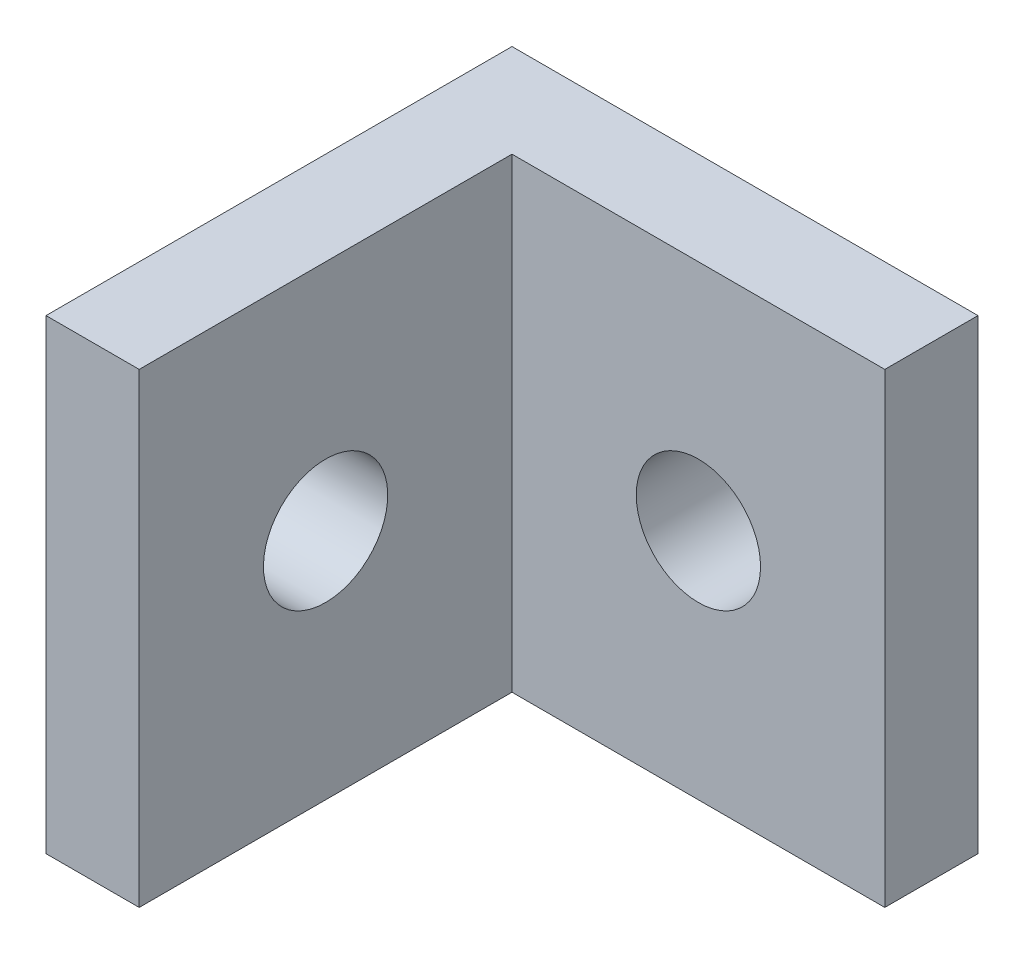
ISO-10303-21;
HEADER;
FILE_DESCRIPTION(('STEP AP214'),'2;1');
FILE_NAME('part.step','',(''),(''),'','','');
FILE_SCHEMA(('AUTOMOTIVE_DESIGN { 1 0 10303 214 1 1 1 1 }'));
ENDSEC;
DATA;
#1=APPLICATION_CONTEXT('core data for automotive mechanical design processes');
#2=APPLICATION_PROTOCOL_DEFINITION('international standard','automotive_design',2000,#1);
#3=PRODUCT_CONTEXT('',#1,'mechanical');
#4=PRODUCT('Part','Part','',(#3));
#5=PRODUCT_RELATED_PRODUCT_CATEGORY('part','',(#4));
#6=PRODUCT_DEFINITION_FORMATION('','',#4);
#7=PRODUCT_DEFINITION_CONTEXT('part definition',#1,'design');
#8=PRODUCT_DEFINITION('design','',#6,#7);
#9=PRODUCT_DEFINITION_SHAPE('','',#8);
#10=(LENGTH_UNIT() NAMED_UNIT(*) SI_UNIT(.MILLI.,.METRE.));
#11=(NAMED_UNIT(*) PLANE_ANGLE_UNIT() SI_UNIT($,.RADIAN.));
#12=(NAMED_UNIT(*) SI_UNIT($,.STERADIAN.) SOLID_ANGLE_UNIT());
#13=UNCERTAINTY_MEASURE_WITH_UNIT(LENGTH_MEASURE(1.E-05),#10,'distance_accuracy_value','');
#14=(GEOMETRIC_REPRESENTATION_CONTEXT(3) GLOBAL_UNCERTAINTY_ASSIGNED_CONTEXT((#13)) GLOBAL_UNIT_ASSIGNED_CONTEXT((#10,
#11,#12)) REPRESENTATION_CONTEXT('',''));
#15=CARTESIAN_POINT('',(0.,0.,0.));
#16=DIRECTION('',(0.,0.,1.));
#17=DIRECTION('',(1.,0.,0.));
#18=AXIS2_PLACEMENT_3D('',#15,#16,#17);
#19=CARTESIAN_POINT('',(7.5,7.5,3.));
#20=DIRECTION('',(-1.,0.,0.));
#21=DIRECTION('',(0.,0.,1.));
#22=AXIS2_PLACEMENT_3D('',#19,#20,#21);
#23=PLANE('',#22);
#24=DIRECTION('',(0.,1.,0.));
#25=VECTOR('',#24,1.);
#26=CARTESIAN_POINT('',(7.5,7.5,0.));
#27=LINE('',#26,#25);
#28=CARTESIAN_POINT('',(7.5,-7.5,0.));
#29=VERTEX_POINT('',#28);
#30=CARTESIAN_POINT('',(7.5,7.5,0.));
#31=VERTEX_POINT('',#30);
#32=EDGE_CURVE('E91',#29,#31,#27,.T.);
#33=ORIENTED_EDGE('',*,*,#32,.T.);
#34=DIRECTION('',(0.,0.,-1.));
#35=VECTOR('',#34,1.);
#36=CARTESIAN_POINT('',(7.5,7.5,3.));
#37=LINE('',#36,#35);
#38=CARTESIAN_POINT('',(7.5,7.5,3.));
#39=VERTEX_POINT('',#38);
#40=EDGE_CURVE('E11',#39,#31,#37,.T.);
#41=ORIENTED_EDGE('',*,*,#40,.F.);
#42=DIRECTION('',(0.,1.,0.));
#43=VECTOR('',#42,1.);
#44=CARTESIAN_POINT('',(7.5,7.5,3.));
#45=LINE('',#44,#43);
#46=CARTESIAN_POINT('',(7.5,-7.5,3.));
#47=VERTEX_POINT('',#46);
#48=EDGE_CURVE('E85',#47,#39,#45,.T.);
#49=ORIENTED_EDGE('',*,*,#48,.F.);
#50=DIRECTION('',(0.,0.,-1.));
#51=VECTOR('',#50,1.);
#52=CARTESIAN_POINT('',(7.5,-7.5,3.));
#53=LINE('',#52,#51);
#54=EDGE_CURVE('E77',#47,#29,#53,.T.);
#55=ORIENTED_EDGE('',*,*,#54,.T.);
#56=EDGE_LOOP('',(#33,#41,#49,#55));
#57=FACE_BOUND('',#56,.T.);
#58=ADVANCED_FACE('F34',(#57),#23,.F.);
#59=CARTESIAN_POINT('',(-7.5,7.5,3.));
#60=DIRECTION('',(0.,-1.,0.));
#61=DIRECTION('',(0.,0.,-1.));
#62=AXIS2_PLACEMENT_3D('',#59,#60,#61);
#63=PLANE('',#62);
#64=DIRECTION('',(-1.,0.,0.));
#65=VECTOR('',#64,1.);
#66=CARTESIAN_POINT('',(-7.5,7.5,0.));
#67=LINE('',#66,#65);
#68=CARTESIAN_POINT('',(-7.5,7.5,0.));
#69=VERTEX_POINT('',#68);
#70=EDGE_CURVE('E94',#31,#69,#67,.T.);
#71=ORIENTED_EDGE('',*,*,#70,.T.);
#72=DIRECTION('',(0.,0.,-1.));
#73=VECTOR('',#72,1.);
#74=CARTESIAN_POINT('',(-7.5,7.5,3.));
#75=LINE('',#74,#73);
#76=CARTESIAN_POINT('',(-7.5,7.5,15.));
#77=VERTEX_POINT('',#76);
#78=EDGE_CURVE('E42',#77,#69,#75,.T.);
#79=ORIENTED_EDGE('',*,*,#78,.F.);
#80=DIRECTION('',(-1.,0.,0.));
#81=VECTOR('',#80,1.);
#82=CARTESIAN_POINT('',(-7.5,7.5,15.));
#83=LINE('',#82,#81);
#84=CARTESIAN_POINT('',(-4.5,7.5,15.));
#85=VERTEX_POINT('',#84);
#86=EDGE_CURVE('E119',#85,#77,#83,.T.);
#87=ORIENTED_EDGE('',*,*,#86,.F.);
#88=DIRECTION('',(0.,0.,-1.));
#89=VECTOR('',#88,1.);
#90=CARTESIAN_POINT('',(-4.5,7.5,15.));
#91=LINE('',#90,#89);
#92=CARTESIAN_POINT('',(-4.5,7.5,3.));
#93=VERTEX_POINT('',#92);
#94=EDGE_CURVE('E99',#85,#93,#91,.T.);
#95=ORIENTED_EDGE('',*,*,#94,.T.);
#96=DIRECTION('',(-1.,0.,0.));
#97=VECTOR('',#96,1.);
#98=CARTESIAN_POINT('',(-7.5,7.5,3.));
#99=LINE('',#98,#97);
#100=EDGE_CURVE('E137',#39,#93,#99,.T.);
#101=ORIENTED_EDGE('',*,*,#100,.F.);
#102=ORIENTED_EDGE('',*,*,#40,.T.);
#103=EDGE_LOOP('',(#71,#79,#87,#95,#101,#102));
#104=FACE_BOUND('',#103,.T.);
#105=ADVANCED_FACE('F116',(#104),#63,.F.);
#106=CARTESIAN_POINT('',(-7.5,7.5,3.));
#107=DIRECTION('',(1.,0.,0.));
#108=DIRECTION('',(0.,1.,0.));
#109=AXIS2_PLACEMENT_3D('',#106,#107,#108);
#110=PLANE('',#109);
#111=CARTESIAN_POINT('',(-7.5,0.,9.));
#112=DIRECTION('',(-1.,0.,0.));
#113=DIRECTION('',(0.,-1.,0.));
#114=AXIS2_PLACEMENT_3D('',#111,#112,#113);
#115=CIRCLE('',#114,2.);
#116=CARTESIAN_POINT('',(-7.5,-2.,9.));
#117=VERTEX_POINT('',#116);
#118=EDGE_CURVE('E154',#117,#117,#115,.T.);
#119=ORIENTED_EDGE('',*,*,#118,.F.);
#120=EDGE_LOOP('',(#119));
#121=FACE_BOUND('',#120,.T.);
#122=DIRECTION('',(0.,-1.,0.));
#123=VECTOR('',#122,1.);
#124=CARTESIAN_POINT('',(-7.5,7.5,0.));
#125=LINE('',#124,#123);
#126=CARTESIAN_POINT('',(-7.5,-7.5,0.));
#127=VERTEX_POINT('',#126);
#128=EDGE_CURVE('E86',#69,#127,#125,.T.);
#129=ORIENTED_EDGE('',*,*,#128,.T.);
#130=DIRECTION('',(0.,0.,-1.));
#131=VECTOR('',#130,1.);
#132=CARTESIAN_POINT('',(-7.5,-7.5,3.));
#133=LINE('',#132,#131);
#134=CARTESIAN_POINT('',(-7.5,-7.5,15.));
#135=VERTEX_POINT('',#134);
#136=EDGE_CURVE('E81',#135,#127,#133,.T.);
#137=ORIENTED_EDGE('',*,*,#136,.F.);
#138=DIRECTION('',(0.,-1.,0.));
#139=VECTOR('',#138,1.);
#140=CARTESIAN_POINT('',(-7.5,7.5,15.));
#141=LINE('',#140,#139);
#142=EDGE_CURVE('E112',#77,#135,#141,.T.);
#143=ORIENTED_EDGE('',*,*,#142,.F.);
#144=ORIENTED_EDGE('',*,*,#78,.T.);
#145=EDGE_LOOP('',(#129,#137,#143,#144));
#146=FACE_BOUND('',#145,.T.);
#147=ADVANCED_FACE('F110',(#121,#146),#110,.F.);
#148=CARTESIAN_POINT('',(-7.5,-7.5,3.));
#149=DIRECTION('',(0.,1.,0.));
#150=DIRECTION('',(0.,0.,1.));
#151=AXIS2_PLACEMENT_3D('',#148,#149,#150);
#152=PLANE('',#151);
#153=DIRECTION('',(1.,0.,0.));
#154=VECTOR('',#153,1.);
#155=CARTESIAN_POINT('',(-7.5,-7.5,0.));
#156=LINE('',#155,#154);
#157=EDGE_CURVE('E74',#127,#29,#156,.T.);
#158=ORIENTED_EDGE('',*,*,#157,.T.);
#159=ORIENTED_EDGE('',*,*,#54,.F.);
#160=DIRECTION('',(1.,0.,0.));
#161=VECTOR('',#160,1.);
#162=CARTESIAN_POINT('',(-7.5,-7.5,3.));
#163=LINE('',#162,#161);
#164=CARTESIAN_POINT('',(-4.5,-7.5,3.));
#165=VERTEX_POINT('',#164);
#166=EDGE_CURVE('E54',#165,#47,#163,.T.);
#167=ORIENTED_EDGE('',*,*,#166,.F.);
#168=DIRECTION('',(0.,0.,-1.));
#169=VECTOR('',#168,1.);
#170=CARTESIAN_POINT('',(-4.5,-7.5,15.));
#171=LINE('',#170,#169);
#172=CARTESIAN_POINT('',(-4.5,-7.5,15.));
#173=VERTEX_POINT('',#172);
#174=EDGE_CURVE('E95',#173,#165,#171,.T.);
#175=ORIENTED_EDGE('',*,*,#174,.F.);
#176=DIRECTION('',(1.,0.,0.));
#177=VECTOR('',#176,1.);
#178=CARTESIAN_POINT('',(-7.5,-7.5,15.));
#179=LINE('',#178,#177);
#180=EDGE_CURVE('E131',#135,#173,#179,.T.);
#181=ORIENTED_EDGE('',*,*,#180,.F.);
#182=ORIENTED_EDGE('',*,*,#136,.T.);
#183=EDGE_LOOP('',(#158,#159,#167,#175,#181,#182));
#184=FACE_BOUND('',#183,.T.);
#185=ADVANCED_FACE('F76',(#184),#152,.F.);
#186=CARTESIAN_POINT('',(0.,0.,3.));
#187=DIRECTION('',(0.,0.,1.));
#188=DIRECTION('',(1.,0.,0.));
#189=AXIS2_PLACEMENT_3D('',#186,#187,#188);
#190=PLANE('',#189);
#191=CARTESIAN_POINT('',(1.5,0.,3.));
#192=DIRECTION('',(0.,0.,1.));
#193=DIRECTION('',(1.,0.,0.));
#194=AXIS2_PLACEMENT_3D('',#191,#192,#193);
#195=CIRCLE('',#194,2.);
#196=CARTESIAN_POINT('',(3.5,0.,3.));
#197=VERTEX_POINT('',#196);
#198=EDGE_CURVE('E135',#197,#197,#195,.T.);
#199=ORIENTED_EDGE('',*,*,#198,.F.);
#200=EDGE_LOOP('',(#199));
#201=FACE_BOUND('',#200,.T.);
#202=DIRECTION('',(0.,1.,0.));
#203=VECTOR('',#202,1.);
#204=CARTESIAN_POINT('',(-4.5,7.5,3.));
#205=LINE('',#204,#203);
#206=EDGE_CURVE('E49',#165,#93,#205,.T.);
#207=ORIENTED_EDGE('',*,*,#206,.F.);
#208=ORIENTED_EDGE('',*,*,#166,.T.);
#209=ORIENTED_EDGE('',*,*,#48,.T.);
#210=ORIENTED_EDGE('',*,*,#100,.T.);
#211=EDGE_LOOP('',(#207,#208,#209,#210));
#212=FACE_BOUND('',#211,.T.);
#213=ADVANCED_FACE('F139',(#201,#212),#190,.T.);
#214=CARTESIAN_POINT('',(0.,0.,0.));
#215=DIRECTION('',(0.,0.,1.));
#216=DIRECTION('',(1.,0.,0.));
#217=AXIS2_PLACEMENT_3D('',#214,#215,#216);
#218=PLANE('',#217);
#219=CARTESIAN_POINT('',(1.5,0.,0.));
#220=DIRECTION('',(0.,0.,-1.));
#221=DIRECTION('',(-1.,0.,0.));
#222=AXIS2_PLACEMENT_3D('',#219,#220,#221);
#223=CIRCLE('',#222,2.);
#224=CARTESIAN_POINT('',(-0.5,0.,0.));
#225=VERTEX_POINT('',#224);
#226=EDGE_CURVE('E151',#225,#225,#223,.T.);
#227=ORIENTED_EDGE('',*,*,#226,.F.);
#228=EDGE_LOOP('',(#227));
#229=FACE_BOUND('',#228,.T.);
#230=ORIENTED_EDGE('',*,*,#32,.F.);
#231=ORIENTED_EDGE('',*,*,#157,.F.);
#232=ORIENTED_EDGE('',*,*,#128,.F.);
#233=ORIENTED_EDGE('',*,*,#70,.F.);
#234=EDGE_LOOP('',(#230,#231,#232,#233));
#235=FACE_BOUND('',#234,.T.);
#236=ADVANCED_FACE('F93',(#229,#235),#218,.F.);
#237=CARTESIAN_POINT('',(-4.5,7.5,15.));
#238=DIRECTION('',(-1.,0.,0.));
#239=DIRECTION('',(0.,-1.,0.));
#240=AXIS2_PLACEMENT_3D('',#237,#238,#239);
#241=PLANE('',#240);
#242=CARTESIAN_POINT('',(-4.5,0.,9.));
#243=DIRECTION('',(-1.,0.,0.));
#244=DIRECTION('',(0.,-1.,0.));
#245=AXIS2_PLACEMENT_3D('',#242,#243,#244);
#246=CIRCLE('',#245,2.);
#247=CARTESIAN_POINT('',(-4.5,-2.,9.));
#248=VERTEX_POINT('',#247);
#249=EDGE_CURVE('E37',#248,#248,#246,.T.);
#250=ORIENTED_EDGE('',*,*,#249,.T.);
#251=EDGE_LOOP('',(#250));
#252=FACE_BOUND('',#251,.T.);
#253=ORIENTED_EDGE('',*,*,#206,.T.);
#254=ORIENTED_EDGE('',*,*,#94,.F.);
#255=DIRECTION('',(0.,1.,0.));
#256=VECTOR('',#255,1.);
#257=CARTESIAN_POINT('',(-4.5,7.5,15.));
#258=LINE('',#257,#256);
#259=EDGE_CURVE('E127',#173,#85,#258,.T.);
#260=ORIENTED_EDGE('',*,*,#259,.F.);
#261=ORIENTED_EDGE('',*,*,#174,.T.);
#262=EDGE_LOOP('',(#253,#254,#260,#261));
#263=FACE_BOUND('',#262,.T.);
#264=ADVANCED_FACE('F141',(#252,#263),#241,.F.);
#265=CARTESIAN_POINT('',(0.,0.,15.));
#266=DIRECTION('',(0.,0.,1.));
#267=DIRECTION('',(1.,0.,0.));
#268=AXIS2_PLACEMENT_3D('',#265,#266,#267);
#269=PLANE('',#268);
#270=ORIENTED_EDGE('',*,*,#142,.T.);
#271=ORIENTED_EDGE('',*,*,#180,.T.);
#272=ORIENTED_EDGE('',*,*,#259,.T.);
#273=ORIENTED_EDGE('',*,*,#86,.T.);
#274=EDGE_LOOP('',(#270,#271,#272,#273));
#275=FACE_BOUND('',#274,.T.);
#276=ADVANCED_FACE('F123',(#275),#269,.T.);
#277=CARTESIAN_POINT('',(1.5,0.,12.));
#278=DIRECTION('',(0.,0.,-1.));
#279=DIRECTION('',(-1.,0.,0.));
#280=AXIS2_PLACEMENT_3D('',#277,#278,#279);
#281=CYLINDRICAL_SURFACE('',#280,2.);
#282=ORIENTED_EDGE('',*,*,#198,.T.);
#283=EDGE_LOOP('',(#282));
#284=FACE_BOUND('',#283,.T.);
#285=ORIENTED_EDGE('',*,*,#226,.T.);
#286=EDGE_LOOP('',(#285));
#287=FACE_BOUND('',#286,.T.);
#288=ADVANCED_FACE('F164',(#284,#287),#281,.F.);
#289=CARTESIAN_POINT('',(4.5,0.,9.));
#290=DIRECTION('',(-1.,0.,0.));
#291=DIRECTION('',(0.,-1.,0.));
#292=AXIS2_PLACEMENT_3D('',#289,#290,#291);
#293=CYLINDRICAL_SURFACE('',#292,2.);
#294=ORIENTED_EDGE('',*,*,#118,.T.);
#295=EDGE_LOOP('',(#294));
#296=FACE_BOUND('',#295,.T.);
#297=ORIENTED_EDGE('',*,*,#249,.F.);
#298=EDGE_LOOP('',(#297));
#299=FACE_BOUND('',#298,.T.);
#300=ADVANCED_FACE('F162',(#296,#299),#293,.F.);
#301=CLOSED_SHELL('',(#58,#105,#147,#185,#213,#236,#264,#276,#288,#300));
#302=MANIFOLD_SOLID_BREP('B2',#301);
#303=ADVANCED_BREP_SHAPE_REPRESENTATION('',(#18,#302),#14);
#304=SHAPE_DEFINITION_REPRESENTATION(#9,#303);
ENDSEC;
END-ISO-10303-21;
